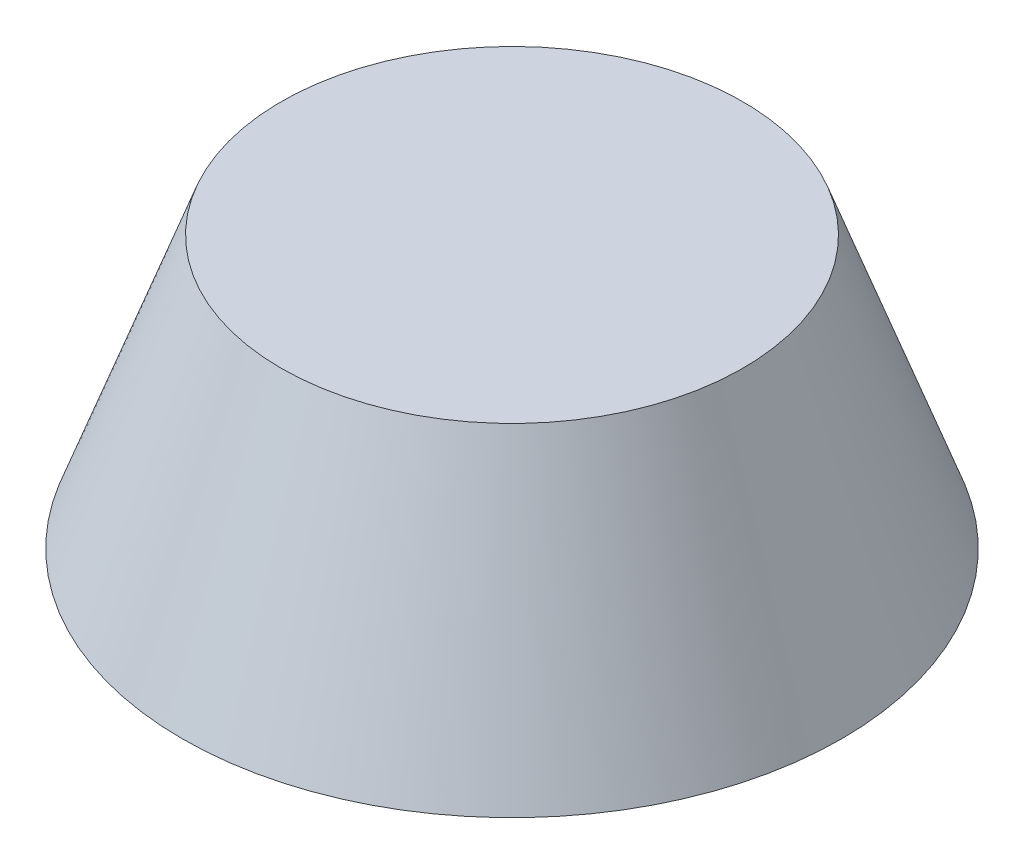
ISO-10303-21;
HEADER;
FILE_DESCRIPTION(('STEP AP214'),'2;1');
FILE_NAME('part.step','',(''),(''),'','','');
FILE_SCHEMA(('AUTOMOTIVE_DESIGN { 1 0 10303 214 1 1 1 1 }'));
ENDSEC;
DATA;
#1=APPLICATION_CONTEXT('core data for automotive mechanical design processes');
#2=APPLICATION_PROTOCOL_DEFINITION('international standard','automotive_design',2000,#1);
#3=PRODUCT_CONTEXT('',#1,'mechanical');
#4=PRODUCT('Part','Part','',(#3));
#5=PRODUCT_RELATED_PRODUCT_CATEGORY('part','',(#4));
#6=PRODUCT_DEFINITION_FORMATION('','',#4);
#7=PRODUCT_DEFINITION_CONTEXT('part definition',#1,'design');
#8=PRODUCT_DEFINITION('design','',#6,#7);
#9=PRODUCT_DEFINITION_SHAPE('','',#8);
#10=(LENGTH_UNIT() NAMED_UNIT(*) SI_UNIT(.MILLI.,.METRE.));
#11=(NAMED_UNIT(*) PLANE_ANGLE_UNIT() SI_UNIT($,.RADIAN.));
#12=(NAMED_UNIT(*) SI_UNIT($,.STERADIAN.) SOLID_ANGLE_UNIT());
#13=UNCERTAINTY_MEASURE_WITH_UNIT(LENGTH_MEASURE(1.E-05),#10,'distance_accuracy_value','');
#14=(GEOMETRIC_REPRESENTATION_CONTEXT(3) GLOBAL_UNCERTAINTY_ASSIGNED_CONTEXT((#13)) GLOBAL_UNIT_ASSIGNED_CONTEXT((#10,
#11,#12)) REPRESENTATION_CONTEXT('',''));
#15=CARTESIAN_POINT('',(0.,0.,0.));
#16=DIRECTION('',(0.,0.,1.));
#17=DIRECTION('',(1.,0.,0.));
#18=AXIS2_PLACEMENT_3D('',#15,#16,#17);
#19=CARTESIAN_POINT('',(0.,0.,0.));
#20=DIRECTION('',(0.,-1.,0.));
#21=DIRECTION('',(0.,0.,1.));
#22=AXIS2_PLACEMENT_3D('',#19,#20,#21);
#23=CONICAL_SURFACE('',#22,17.,0.349065850398867);
#24=CARTESIAN_POINT('',(0.,14.,0.));
#25=DIRECTION('',(0.,1.,0.));
#26=DIRECTION('',(0.,0.,1.));
#27=AXIS2_PLACEMENT_3D('',#24,#25,#26);
#28=CIRCLE('',#27,11.9044167202732);
#29=CARTESIAN_POINT('',(0.,14.,11.9044167202732));
#30=VERTEX_POINT('',#29);
#31=EDGE_CURVE('E10',#30,#30,#28,.T.);
#32=ORIENTED_EDGE('',*,*,#31,.F.);
#33=EDGE_LOOP('',(#32));
#34=FACE_BOUND('',#33,.T.);
#35=CARTESIAN_POINT('',(0.,0.,0.));
#36=DIRECTION('',(0.,1.,0.));
#37=DIRECTION('',(0.,0.,1.));
#38=AXIS2_PLACEMENT_3D('',#35,#36,#37);
#39=CIRCLE('',#38,17.);
#40=CARTESIAN_POINT('',(0.,0.,17.));
#41=VERTEX_POINT('',#40);
#42=EDGE_CURVE('E48',#41,#41,#39,.T.);
#43=ORIENTED_EDGE('',*,*,#42,.T.);
#44=EDGE_LOOP('',(#43));
#45=FACE_BOUND('',#44,.T.);
#46=ADVANCED_FACE('F41',(#34,#45),#23,.T.);
#47=CARTESIAN_POINT('',(0.,14.,0.));
#48=DIRECTION('',(0.,1.,0.));
#49=DIRECTION('',(0.,0.,1.));
#50=AXIS2_PLACEMENT_3D('',#47,#48,#49);
#51=PLANE('',#50);
#52=ORIENTED_EDGE('',*,*,#31,.T.);
#53=EDGE_LOOP('',(#52));
#54=FACE_BOUND('',#53,.T.);
#55=ADVANCED_FACE('F60',(#54),#51,.T.);
#56=CARTESIAN_POINT('',(0.,0.,0.));
#57=DIRECTION('',(0.,1.,0.));
#58=DIRECTION('',(0.,0.,1.));
#59=AXIS2_PLACEMENT_3D('',#56,#57,#58);
#60=PLANE('',#59);
#61=ORIENTED_EDGE('',*,*,#42,.F.);
#62=EDGE_LOOP('',(#61));
#63=FACE_BOUND('',#62,.T.);
#64=ADVANCED_FACE('F58',(#63),#60,.F.);
#65=CLOSED_SHELL('',(#46,#55,#64));
#66=MANIFOLD_SOLID_BREP('B2',#65);
#67=ADVANCED_BREP_SHAPE_REPRESENTATION('',(#18,#66),#14);
#68=SHAPE_DEFINITION_REPRESENTATION(#9,#67);
ENDSEC;
END-ISO-10303-21;
